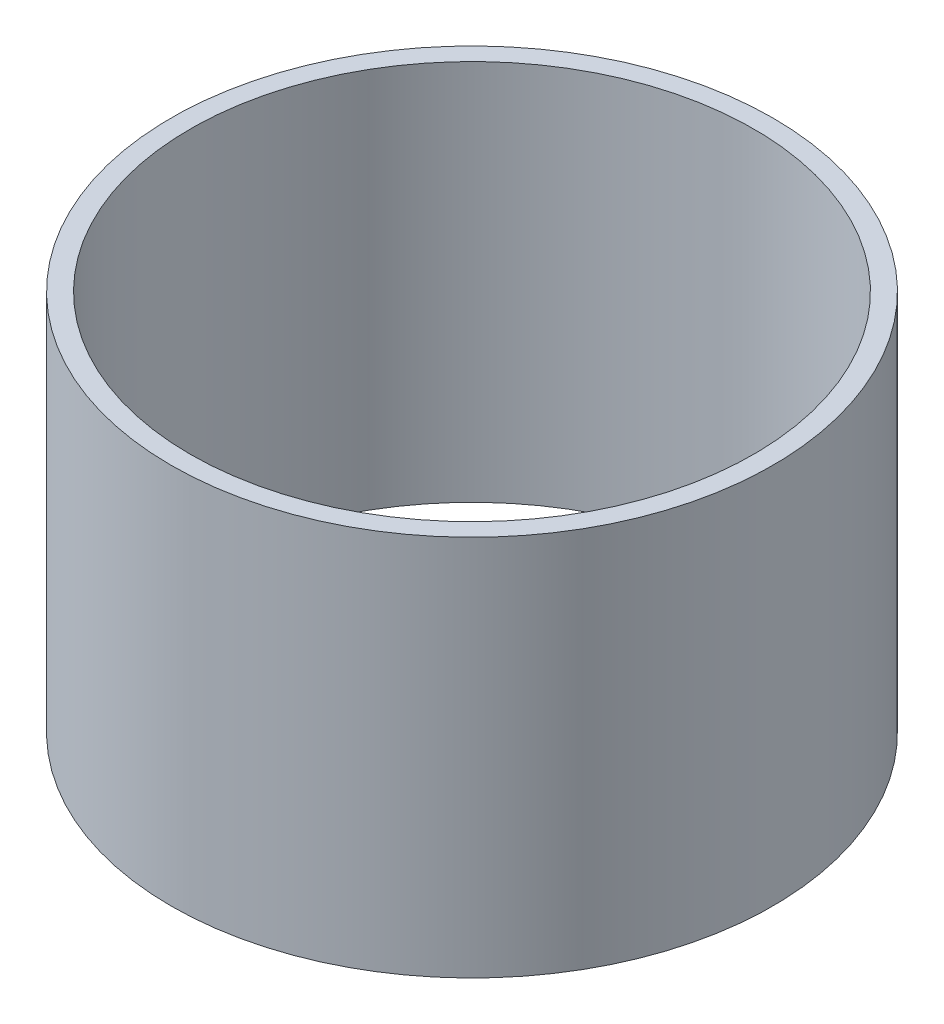
ISO-10303-21;
HEADER;
FILE_DESCRIPTION(('STEP AP214'),'2;1');
FILE_NAME('part.step','',(''),(''),'','','');
FILE_SCHEMA(('AUTOMOTIVE_DESIGN { 1 0 10303 214 1 1 1 1 }'));
ENDSEC;
DATA;
#1=APPLICATION_CONTEXT('core data for automotive mechanical design processes');
#2=APPLICATION_PROTOCOL_DEFINITION('international standard','automotive_design',2000,#1);
#3=PRODUCT_CONTEXT('',#1,'mechanical');
#4=PRODUCT('Part','Part','',(#3));
#5=PRODUCT_RELATED_PRODUCT_CATEGORY('part','',(#4));
#6=PRODUCT_DEFINITION_FORMATION('','',#4);
#7=PRODUCT_DEFINITION_CONTEXT('part definition',#1,'design');
#8=PRODUCT_DEFINITION('design','',#6,#7);
#9=PRODUCT_DEFINITION_SHAPE('','',#8);
#10=(LENGTH_UNIT() NAMED_UNIT(*) SI_UNIT(.MILLI.,.METRE.));
#11=(NAMED_UNIT(*) PLANE_ANGLE_UNIT() SI_UNIT($,.RADIAN.));
#12=(NAMED_UNIT(*) SI_UNIT($,.STERADIAN.) SOLID_ANGLE_UNIT());
#13=UNCERTAINTY_MEASURE_WITH_UNIT(LENGTH_MEASURE(1.E-05),#10,'distance_accuracy_value','');
#14=(GEOMETRIC_REPRESENTATION_CONTEXT(3) GLOBAL_UNCERTAINTY_ASSIGNED_CONTEXT((#13)) GLOBAL_UNIT_ASSIGNED_CONTEXT((#10,
#11,#12)) REPRESENTATION_CONTEXT('',''));
#15=CARTESIAN_POINT('',(0.,0.,0.));
#16=DIRECTION('',(0.,0.,1.));
#17=DIRECTION('',(1.,0.,0.));
#18=AXIS2_PLACEMENT_3D('',#15,#16,#17);
#19=CARTESIAN_POINT('',(0.,50.8,0.));
#20=DIRECTION('',(0.,1.,0.));
#21=DIRECTION('',(0.,0.,1.));
#22=AXIS2_PLACEMENT_3D('',#19,#20,#21);
#23=PLANE('',#22);
#24=CARTESIAN_POINT('',(0.,50.8,0.));
#25=DIRECTION('',(0.,1.,0.));
#26=DIRECTION('',(0.,0.,1.));
#27=AXIS2_PLACEMENT_3D('',#24,#25,#26);
#28=CIRCLE('',#27,40.04);
#29=CARTESIAN_POINT('',(0.,50.8,40.04));
#30=VERTEX_POINT('',#29);
#31=EDGE_CURVE('E10',#30,#30,#28,.T.);
#32=ORIENTED_EDGE('',*,*,#31,.T.);
#33=EDGE_LOOP('',(#32));
#34=FACE_BOUND('',#33,.T.);
#35=CARTESIAN_POINT('',(0.,50.8,0.));
#36=DIRECTION('',(0.,1.,0.));
#37=DIRECTION('',(0.,0.,1.));
#38=AXIS2_PLACEMENT_3D('',#35,#36,#37);
#39=CIRCLE('',#38,37.5);
#40=CARTESIAN_POINT('',(0.,50.8,37.5));
#41=VERTEX_POINT('',#40);
#42=EDGE_CURVE('E42',#41,#41,#39,.T.);
#43=ORIENTED_EDGE('',*,*,#42,.F.);
#44=EDGE_LOOP('',(#43));
#45=FACE_BOUND('',#44,.T.);
#46=ADVANCED_FACE('F31',(#34,#45),#23,.T.);
#47=CARTESIAN_POINT('',(0.,0.,0.));
#48=DIRECTION('',(0.,1.,0.));
#49=DIRECTION('',(0.,0.,1.));
#50=AXIS2_PLACEMENT_3D('',#47,#48,#49);
#51=PLANE('',#50);
#52=CARTESIAN_POINT('',(0.,0.,0.));
#53=DIRECTION('',(0.,1.,0.));
#54=DIRECTION('',(0.,0.,1.));
#55=AXIS2_PLACEMENT_3D('',#52,#53,#54);
#56=CIRCLE('',#55,40.04);
#57=CARTESIAN_POINT('',(0.,0.,40.04));
#58=VERTEX_POINT('',#57);
#59=EDGE_CURVE('E35',#58,#58,#56,.T.);
#60=ORIENTED_EDGE('',*,*,#59,.F.);
#61=EDGE_LOOP('',(#60));
#62=FACE_BOUND('',#61,.T.);
#63=CARTESIAN_POINT('',(0.,0.,0.));
#64=DIRECTION('',(0.,1.,0.));
#65=DIRECTION('',(0.,0.,1.));
#66=AXIS2_PLACEMENT_3D('',#63,#64,#65);
#67=CIRCLE('',#66,37.5);
#68=CARTESIAN_POINT('',(0.,0.,37.5));
#69=VERTEX_POINT('',#68);
#70=EDGE_CURVE('E44',#69,#69,#67,.T.);
#71=ORIENTED_EDGE('',*,*,#70,.T.);
#72=EDGE_LOOP('',(#71));
#73=FACE_BOUND('',#72,.T.);
#74=ADVANCED_FACE('F54',(#62,#73),#51,.F.);
#75=CARTESIAN_POINT('',(0.,50.8,0.));
#76=DIRECTION('',(0.,-1.,0.));
#77=DIRECTION('',(0.,0.,-1.));
#78=AXIS2_PLACEMENT_3D('',#75,#76,#77);
#79=CYLINDRICAL_SURFACE('',#78,40.04);
#80=ORIENTED_EDGE('',*,*,#31,.F.);
#81=EDGE_LOOP('',(#80));
#82=FACE_BOUND('',#81,.T.);
#83=ORIENTED_EDGE('',*,*,#59,.T.);
#84=EDGE_LOOP('',(#83));
#85=FACE_BOUND('',#84,.T.);
#86=ADVANCED_FACE('F33',(#82,#85),#79,.T.);
#87=CARTESIAN_POINT('',(0.,50.8,0.));
#88=DIRECTION('',(0.,-1.,0.));
#89=DIRECTION('',(0.,0.,-1.));
#90=AXIS2_PLACEMENT_3D('',#87,#88,#89);
#91=CYLINDRICAL_SURFACE('',#90,37.5);
#92=ORIENTED_EDGE('',*,*,#42,.T.);
#93=EDGE_LOOP('',(#92));
#94=FACE_BOUND('',#93,.T.);
#95=ORIENTED_EDGE('',*,*,#70,.F.);
#96=EDGE_LOOP('',(#95));
#97=FACE_BOUND('',#96,.T.);
#98=ADVANCED_FACE('F50',(#94,#97),#91,.F.);
#99=CLOSED_SHELL('',(#46,#74,#86,#98));
#100=MANIFOLD_SOLID_BREP('B2',#99);
#101=ADVANCED_BREP_SHAPE_REPRESENTATION('',(#18,#100),#14);
#102=SHAPE_DEFINITION_REPRESENTATION(#9,#101);
ENDSEC;
END-ISO-10303-21;
